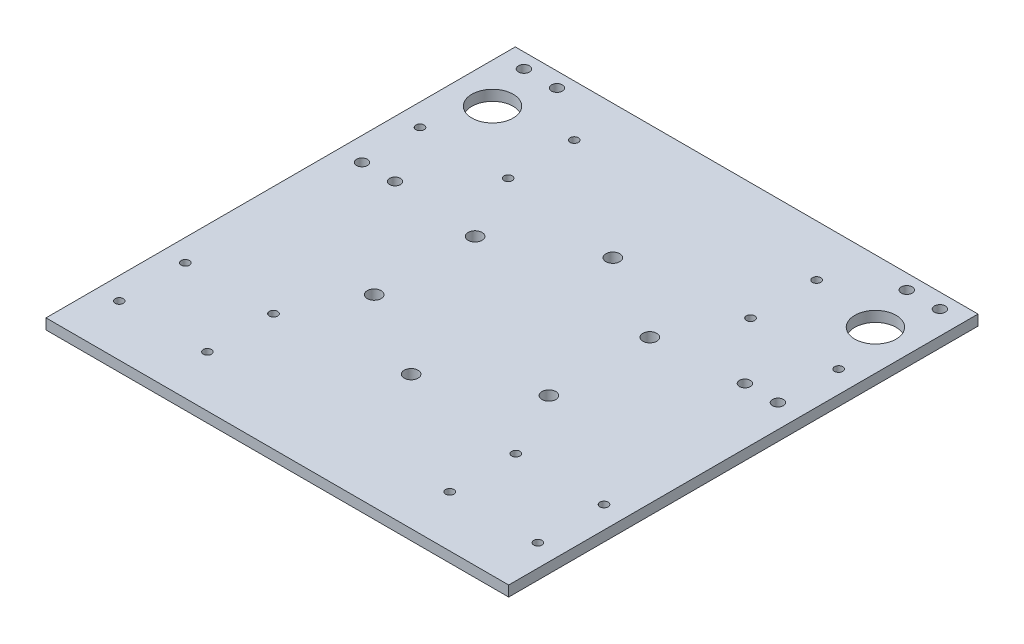
ISO-10303-21;
HEADER;
FILE_DESCRIPTION(('STEP AP214'),'2;1');
FILE_NAME('part.step','',(''),(''),'','','');
FILE_SCHEMA(('AUTOMOTIVE_DESIGN { 1 0 10303 214 1 1 1 1 }'));
ENDSEC;
DATA;
#1=APPLICATION_CONTEXT('core data for automotive mechanical design processes');
#2=APPLICATION_PROTOCOL_DEFINITION('international standard','automotive_design',2000,#1);
#3=PRODUCT_CONTEXT('',#1,'mechanical');
#4=PRODUCT('Part','Part','',(#3));
#5=PRODUCT_RELATED_PRODUCT_CATEGORY('part','',(#4));
#6=PRODUCT_DEFINITION_FORMATION('','',#4);
#7=PRODUCT_DEFINITION_CONTEXT('part definition',#1,'design');
#8=PRODUCT_DEFINITION('design','',#6,#7);
#9=PRODUCT_DEFINITION_SHAPE('','',#8);
#10=(LENGTH_UNIT() NAMED_UNIT(*) SI_UNIT(.MILLI.,.METRE.));
#11=(NAMED_UNIT(*) PLANE_ANGLE_UNIT() SI_UNIT($,.RADIAN.));
#12=(NAMED_UNIT(*) SI_UNIT($,.STERADIAN.) SOLID_ANGLE_UNIT());
#13=UNCERTAINTY_MEASURE_WITH_UNIT(LENGTH_MEASURE(1.E-05),#10,'distance_accuracy_value','');
#14=(GEOMETRIC_REPRESENTATION_CONTEXT(3) GLOBAL_UNCERTAINTY_ASSIGNED_CONTEXT((#13)) GLOBAL_UNIT_ASSIGNED_CONTEXT((#10,
#11,#12)) REPRESENTATION_CONTEXT('',''));
#15=CARTESIAN_POINT('',(0.,0.,0.));
#16=DIRECTION('',(0.,0.,1.));
#17=DIRECTION('',(1.,0.,0.));
#18=AXIS2_PLACEMENT_3D('',#15,#16,#17);
#19=CARTESIAN_POINT('',(0.,3.175,0.));
#20=DIRECTION('',(0.,-1.,0.));
#21=DIRECTION('',(0.,0.,-1.));
#22=AXIS2_PLACEMENT_3D('',#19,#20,#21);
#23=PLANE('',#22);
#24=CARTESIAN_POINT('',(-4.73926453636864E-12,3.175,30.525));
#25=DIRECTION('',(0.,1.,0.));
#26=DIRECTION('',(0.,0.,1.));
#27=AXIS2_PLACEMENT_3D('',#24,#25,#26);
#28=CIRCLE('',#27,2.1);
#29=CARTESIAN_POINT('',(-4.73926453636864E-12,3.175,32.625));
#30=VERTEX_POINT('',#29);
#31=EDGE_CURVE('E567',#30,#30,#28,.T.);
#32=ORIENTED_EDGE('',*,*,#31,.F.);
#33=EDGE_LOOP('',(#32));
#34=FACE_BOUND('',#33,.T.);
#35=CARTESIAN_POINT('',(26.4354254505184,3.175,15.2625000000027));
#36=DIRECTION('',(0.,1.,0.));
#37=DIRECTION('',(0.,0.,1.));
#38=AXIS2_PLACEMENT_3D('',#35,#36,#37);
#39=CIRCLE('',#38,2.1);
#40=CARTESIAN_POINT('',(26.4354254505184,3.175,17.3625000000027));
#41=VERTEX_POINT('',#40);
#42=EDGE_CURVE('E580',#41,#41,#39,.T.);
#43=ORIENTED_EDGE('',*,*,#42,.F.);
#44=EDGE_LOOP('',(#43));
#45=FACE_BOUND('',#44,.T.);
#46=CARTESIAN_POINT('',(-26.4354254505232,3.175,15.2624999999945));
#47=DIRECTION('',(0.,1.,0.));
#48=DIRECTION('',(0.,0.,1.));
#49=AXIS2_PLACEMENT_3D('',#46,#47,#48);
#50=CIRCLE('',#49,2.1);
#51=CARTESIAN_POINT('',(-26.4354254505232,3.175,17.3624999999945));
#52=VERTEX_POINT('',#51);
#53=EDGE_CURVE('E588',#52,#52,#50,.T.);
#54=ORIENTED_EDGE('',*,*,#53,.F.);
#55=EDGE_LOOP('',(#54));
#56=FACE_BOUND('',#55,.T.);
#57=CARTESIAN_POINT('',(26.4354254505208,3.175,-15.2624999999986));
#58=DIRECTION('',(0.,1.,0.));
#59=DIRECTION('',(0.,0.,1.));
#60=AXIS2_PLACEMENT_3D('',#57,#58,#59);
#61=CIRCLE('',#60,2.1);
#62=CARTESIAN_POINT('',(26.4354254505208,3.175,-13.1624999999986));
#63=VERTEX_POINT('',#62);
#64=EDGE_CURVE('E597',#63,#63,#61,.T.);
#65=ORIENTED_EDGE('',*,*,#64,.F.);
#66=EDGE_LOOP('',(#65));
#67=FACE_BOUND('',#66,.T.);
#68=CARTESIAN_POINT('',(0.,3.175,-30.525));
#69=DIRECTION('',(0.,1.,0.));
#70=DIRECTION('',(0.,0.,1.));
#71=AXIS2_PLACEMENT_3D('',#68,#69,#70);
#72=CIRCLE('',#71,2.1);
#73=CARTESIAN_POINT('',(0.,3.175,-28.425));
#74=VERTEX_POINT('',#73);
#75=EDGE_CURVE('E566',#74,#74,#72,.T.);
#76=ORIENTED_EDGE('',*,*,#75,.F.);
#77=EDGE_LOOP('',(#76));
#78=FACE_BOUND('',#77,.T.);
#79=CARTESIAN_POINT('',(-26.435425450516,3.175,-15.2625000000069));
#80=DIRECTION('',(0.,1.,0.));
#81=DIRECTION('',(0.,0.,1.));
#82=AXIS2_PLACEMENT_3D('',#79,#80,#81);
#83=CIRCLE('',#82,2.1);
#84=CARTESIAN_POINT('',(-26.435425450516,3.175,-13.1625000000069));
#85=VERTEX_POINT('',#84);
#86=EDGE_CURVE('E559',#85,#85,#83,.T.);
#87=ORIENTED_EDGE('',*,*,#86,.F.);
#88=EDGE_LOOP('',(#87));
#89=FACE_BOUND('',#88,.T.);
#90=CARTESIAN_POINT('',(62.9286,3.175,-17.5357));
#91=DIRECTION('',(0.,1.,0.));
#92=DIRECTION('',(0.,0.,1.));
#93=AXIS2_PLACEMENT_3D('',#90,#91,#92);
#94=CIRCLE('',#93,1.65);
#95=CARTESIAN_POINT('',(62.9286,3.175,-15.8857));
#96=VERTEX_POINT('',#95);
#97=EDGE_CURVE('E163',#96,#96,#94,.T.);
#98=ORIENTED_EDGE('',*,*,#97,.F.);
#99=EDGE_LOOP('',(#98));
#100=FACE_BOUND('',#99,.T.);
#101=CARTESIAN_POINT('',(36.6666666666667,3.175,-35.5));
#102=DIRECTION('',(0.,1.,0.));
#103=DIRECTION('',(0.,0.,1.));
#104=AXIS2_PLACEMENT_3D('',#101,#102,#103);
#105=CIRCLE('',#104,1.25);
#106=CARTESIAN_POINT('',(36.6666666666667,3.175,-34.25));
#107=VERTEX_POINT('',#106);
#108=EDGE_CURVE('E180',#107,#107,#105,.T.);
#109=ORIENTED_EDGE('',*,*,#108,.F.);
#110=EDGE_LOOP('',(#109));
#111=FACE_BOUND('',#110,.T.);
#112=CARTESIAN_POINT('',(-57.9286,3.175,-52.0357));
#113=DIRECTION('',(0.,1.,0.));
#114=DIRECTION('',(0.,0.,1.));
#115=AXIS2_PLACEMENT_3D('',#112,#113,#114);
#116=CIRCLE('',#115,6.25);
#117=CARTESIAN_POINT('',(-57.9286,3.175,-45.7857));
#118=VERTEX_POINT('',#117);
#119=EDGE_CURVE('E282',#118,#118,#116,.T.);
#120=ORIENTED_EDGE('',*,*,#119,.F.);
#121=EDGE_LOOP('',(#120));
#122=FACE_BOUND('',#121,.T.);
#123=CARTESIAN_POINT('',(-36.6666666666667,3.175,-55.5));
#124=DIRECTION('',(0.,1.,0.));
#125=DIRECTION('',(0.,0.,1.));
#126=AXIS2_PLACEMENT_3D('',#123,#124,#125);
#127=CIRCLE('',#126,1.25);
#128=CARTESIAN_POINT('',(-36.6666666666667,3.175,-54.25));
#129=VERTEX_POINT('',#128);
#130=EDGE_CURVE('E281',#129,#129,#127,.T.);
#131=ORIENTED_EDGE('',*,*,#130,.F.);
#132=EDGE_LOOP('',(#131));
#133=FACE_BOUND('',#132,.T.);
#134=CARTESIAN_POINT('',(52.9286,3.175,-66.5357));
#135=DIRECTION('',(0.,1.,0.));
#136=DIRECTION('',(0.,0.,1.));
#137=AXIS2_PLACEMENT_3D('',#134,#135,#136);
#138=CIRCLE('',#137,1.64999999999998);
#139=CARTESIAN_POINT('',(52.9286,3.175,-64.8857));
#140=VERTEX_POINT('',#139);
#141=EDGE_CURVE('E259',#140,#140,#138,.T.);
#142=ORIENTED_EDGE('',*,*,#141,.F.);
#143=EDGE_LOOP('',(#142));
#144=FACE_BOUND('',#143,.T.);
#145=CARTESIAN_POINT('',(-52.9286,3.175,-17.5357));
#146=DIRECTION('',(0.,1.,0.));
#147=DIRECTION('',(0.,0.,1.));
#148=AXIS2_PLACEMENT_3D('',#145,#146,#147);
#149=CIRCLE('',#148,1.64999999999998);
#150=CARTESIAN_POINT('',(-52.9286,3.175,-15.8857));
#151=VERTEX_POINT('',#150);
#152=EDGE_CURVE('E301',#151,#151,#149,.T.);
#153=ORIENTED_EDGE('',*,*,#152,.F.);
#154=EDGE_LOOP('',(#153));
#155=FACE_BOUND('',#154,.T.);
#156=CARTESIAN_POINT('',(-63.3333333333334,3.175,-35.5));
#157=DIRECTION('',(0.,1.,0.));
#158=DIRECTION('',(0.,0.,1.));
#159=AXIS2_PLACEMENT_3D('',#156,#157,#158);
#160=CIRCLE('',#159,1.25);
#161=CARTESIAN_POINT('',(-63.3333333333334,3.175,-34.25));
#162=VERTEX_POINT('',#161);
#163=EDGE_CURVE('E300',#162,#162,#160,.T.);
#164=ORIENTED_EDGE('',*,*,#163,.F.);
#165=EDGE_LOOP('',(#164));
#166=FACE_BOUND('',#165,.T.);
#167=CARTESIAN_POINT('',(63.3333333333334,3.175,35.5));
#168=DIRECTION('',(0.,1.,0.));
#169=DIRECTION('',(0.,0.,1.));
#170=AXIS2_PLACEMENT_3D('',#167,#168,#169);
#171=CIRCLE('',#170,1.25);
#172=CARTESIAN_POINT('',(63.3333333333334,3.175,36.75));
#173=VERTEX_POINT('',#172);
#174=EDGE_CURVE('E308',#173,#173,#171,.T.);
#175=ORIENTED_EDGE('',*,*,#174,.F.);
#176=EDGE_LOOP('',(#175));
#177=FACE_BOUND('',#176,.T.);
#178=CARTESIAN_POINT('',(36.6666666666667,3.175,55.5));
#179=DIRECTION('',(0.,1.,0.));
#180=DIRECTION('',(0.,0.,1.));
#181=AXIS2_PLACEMENT_3D('',#178,#179,#180);
#182=CIRCLE('',#181,1.25);
#183=CARTESIAN_POINT('',(36.6666666666667,3.175,56.75));
#184=VERTEX_POINT('',#183);
#185=EDGE_CURVE('E318',#184,#184,#182,.T.);
#186=ORIENTED_EDGE('',*,*,#185,.F.);
#187=EDGE_LOOP('',(#186));
#188=FACE_BOUND('',#187,.T.);
#189=CARTESIAN_POINT('',(-36.6666666666667,3.175,35.5));
#190=DIRECTION('',(0.,1.,0.));
#191=DIRECTION('',(0.,0.,1.));
#192=AXIS2_PLACEMENT_3D('',#189,#190,#191);
#193=CIRCLE('',#192,1.25);
#194=CARTESIAN_POINT('',(-36.6666666666667,3.175,36.75));
#195=VERTEX_POINT('',#194);
#196=EDGE_CURVE('E139',#195,#195,#193,.T.);
#197=ORIENTED_EDGE('',*,*,#196,.F.);
#198=EDGE_LOOP('',(#197));
#199=FACE_BOUND('',#198,.T.);
#200=CARTESIAN_POINT('',(-63.3333333333334,3.175,55.5));
#201=DIRECTION('',(0.,1.,0.));
#202=DIRECTION('',(0.,0.,1.));
#203=AXIS2_PLACEMENT_3D('',#200,#201,#202);
#204=CIRCLE('',#203,1.25);
#205=CARTESIAN_POINT('',(-63.3333333333334,3.175,56.75));
#206=VERTEX_POINT('',#205);
#207=EDGE_CURVE('E140',#206,#206,#204,.T.);
#208=ORIENTED_EDGE('',*,*,#207,.F.);
#209=EDGE_LOOP('',(#208));
#210=FACE_BOUND('',#209,.T.);
#211=CARTESIAN_POINT('',(-62.9286,3.175,-66.5357));
#212=DIRECTION('',(0.,1.,0.));
#213=DIRECTION('',(0.,0.,1.));
#214=AXIS2_PLACEMENT_3D('',#211,#212,#213);
#215=CIRCLE('',#214,1.65);
#216=CARTESIAN_POINT('',(-62.9286,3.175,-64.8857));
#217=VERTEX_POINT('',#216);
#218=EDGE_CURVE('E275',#217,#217,#215,.T.);
#219=ORIENTED_EDGE('',*,*,#218,.F.);
#220=EDGE_LOOP('',(#219));
#221=FACE_BOUND('',#220,.T.);
#222=DIRECTION('',(0.,0.,-1.));
#223=VECTOR('',#222,1.);
#224=CARTESIAN_POINT('',(70.,3.175,71.));
#225=LINE('',#224,#223);
#226=CARTESIAN_POINT('',(70.,3.175,71.));
#227=VERTEX_POINT('',#226);
#228=CARTESIAN_POINT('',(70.,3.175,-71.));
#229=VERTEX_POINT('',#228);
#230=EDGE_CURVE('E99',#227,#229,#225,.T.);
#231=ORIENTED_EDGE('',*,*,#230,.T.);
#232=DIRECTION('',(-1.,0.,0.));
#233=VECTOR('',#232,1.);
#234=CARTESIAN_POINT('',(-70.,3.175,-71.));
#235=LINE('',#234,#233);
#236=CARTESIAN_POINT('',(-70.,3.175,-71.));
#237=VERTEX_POINT('',#236);
#238=EDGE_CURVE('E94',#229,#237,#235,.T.);
#239=ORIENTED_EDGE('',*,*,#238,.T.);
#240=DIRECTION('',(0.,0.,1.));
#241=VECTOR('',#240,1.);
#242=CARTESIAN_POINT('',(-70.,3.175,71.));
#243=LINE('',#242,#241);
#244=CARTESIAN_POINT('',(-70.,3.175,71.));
#245=VERTEX_POINT('',#244);
#246=EDGE_CURVE('E97',#237,#245,#243,.T.);
#247=ORIENTED_EDGE('',*,*,#246,.T.);
#248=DIRECTION('',(1.,0.,0.));
#249=VECTOR('',#248,1.);
#250=CARTESIAN_POINT('',(-70.,3.175,71.));
#251=LINE('',#250,#249);
#252=EDGE_CURVE('E64',#245,#227,#251,.T.);
#253=ORIENTED_EDGE('',*,*,#252,.T.);
#254=EDGE_LOOP('',(#231,#239,#247,#253));
#255=FACE_BOUND('',#254,.T.);
#256=CARTESIAN_POINT('',(36.6666666666667,3.175,35.5));
#257=DIRECTION('',(0.,-1.,0.));
#258=DIRECTION('',(0.,0.,-1.));
#259=AXIS2_PLACEMENT_3D('',#256,#257,#258);
#260=CIRCLE('',#259,1.25);
#261=CARTESIAN_POINT('',(36.6666666666667,3.175,34.25));
#262=VERTEX_POINT('',#261);
#263=EDGE_CURVE('E127',#262,#262,#260,.T.);
#264=ORIENTED_EDGE('',*,*,#263,.T.);
#265=EDGE_LOOP('',(#264));
#266=FACE_BOUND('',#265,.T.);
#267=CARTESIAN_POINT('',(-36.6666666666667,3.175,55.5));
#268=DIRECTION('',(0.,-1.,0.));
#269=DIRECTION('',(0.,0.,-1.));
#270=AXIS2_PLACEMENT_3D('',#267,#268,#269);
#271=CIRCLE('',#270,1.25);
#272=CARTESIAN_POINT('',(-36.6666666666667,3.175,54.25));
#273=VERTEX_POINT('',#272);
#274=EDGE_CURVE('E326',#273,#273,#271,.T.);
#275=ORIENTED_EDGE('',*,*,#274,.T.);
#276=EDGE_LOOP('',(#275));
#277=FACE_BOUND('',#276,.T.);
#278=CARTESIAN_POINT('',(63.3333333333334,3.175,55.5));
#279=DIRECTION('',(0.,-1.,0.));
#280=DIRECTION('',(0.,0.,-1.));
#281=AXIS2_PLACEMENT_3D('',#278,#279,#280);
#282=CIRCLE('',#281,1.25);
#283=CARTESIAN_POINT('',(63.3333333333334,3.175,54.25));
#284=VERTEX_POINT('',#283);
#285=EDGE_CURVE('E319',#284,#284,#282,.T.);
#286=ORIENTED_EDGE('',*,*,#285,.T.);
#287=EDGE_LOOP('',(#286));
#288=FACE_BOUND('',#287,.T.);
#289=CARTESIAN_POINT('',(-62.9286,3.175,-17.5357));
#290=DIRECTION('',(0.,-1.,0.));
#291=DIRECTION('',(0.,0.,-1.));
#292=AXIS2_PLACEMENT_3D('',#289,#290,#291);
#293=CIRCLE('',#292,1.65);
#294=CARTESIAN_POINT('',(-62.9286,3.175,-19.1857));
#295=VERTEX_POINT('',#294);
#296=EDGE_CURVE('E258',#295,#295,#293,.T.);
#297=ORIENTED_EDGE('',*,*,#296,.T.);
#298=EDGE_LOOP('',(#297));
#299=FACE_BOUND('',#298,.T.);
#300=CARTESIAN_POINT('',(-52.9286,3.175,-66.5357));
#301=DIRECTION('',(0.,-1.,0.));
#302=DIRECTION('',(0.,0.,-1.));
#303=AXIS2_PLACEMENT_3D('',#300,#301,#302);
#304=CIRCLE('',#303,1.64999999999998);
#305=CARTESIAN_POINT('',(-52.9286,3.175,-68.1857));
#306=VERTEX_POINT('',#305);
#307=EDGE_CURVE('E269',#306,#306,#304,.T.);
#308=ORIENTED_EDGE('',*,*,#307,.T.);
#309=EDGE_LOOP('',(#308));
#310=FACE_BOUND('',#309,.T.);
#311=CARTESIAN_POINT('',(-36.6666666666667,3.175,-35.5));
#312=DIRECTION('',(0.,-1.,0.));
#313=DIRECTION('',(0.,0.,-1.));
#314=AXIS2_PLACEMENT_3D('',#311,#312,#313);
#315=CIRCLE('',#314,1.25);
#316=CARTESIAN_POINT('',(-36.6666666666667,3.175,-36.75));
#317=VERTEX_POINT('',#316);
#318=EDGE_CURVE('E517',#317,#317,#315,.T.);
#319=ORIENTED_EDGE('',*,*,#318,.T.);
#320=EDGE_LOOP('',(#319));
#321=FACE_BOUND('',#320,.T.);
#322=CARTESIAN_POINT('',(52.9286,3.175,-17.5357));
#323=DIRECTION('',(0.,-1.,0.));
#324=DIRECTION('',(0.,0.,-1.));
#325=AXIS2_PLACEMENT_3D('',#322,#323,#324);
#326=CIRCLE('',#325,1.64999999999998);
#327=CARTESIAN_POINT('',(52.9286,3.175,-19.1857));
#328=VERTEX_POINT('',#327);
#329=EDGE_CURVE('E191',#328,#328,#326,.T.);
#330=ORIENTED_EDGE('',*,*,#329,.T.);
#331=EDGE_LOOP('',(#330));
#332=FACE_BOUND('',#331,.T.);
#333=CARTESIAN_POINT('',(-63.3333333333334,3.175,35.5));
#334=DIRECTION('',(0.,-1.,0.));
#335=DIRECTION('',(0.,0.,-1.));
#336=AXIS2_PLACEMENT_3D('',#333,#334,#335);
#337=CIRCLE('',#336,1.25);
#338=CARTESIAN_POINT('',(-63.3333333333334,3.175,34.25));
#339=VERTEX_POINT('',#338);
#340=EDGE_CURVE('E164',#339,#339,#337,.T.);
#341=ORIENTED_EDGE('',*,*,#340,.T.);
#342=EDGE_LOOP('',(#341));
#343=FACE_BOUND('',#342,.T.);
#344=CARTESIAN_POINT('',(62.9286,3.175,-66.5357));
#345=DIRECTION('',(0.,-1.,0.));
#346=DIRECTION('',(0.,0.,-1.));
#347=AXIS2_PLACEMENT_3D('',#344,#345,#346);
#348=CIRCLE('',#347,1.65);
#349=CARTESIAN_POINT('',(62.9286,3.175,-68.1857));
#350=VERTEX_POINT('',#349);
#351=EDGE_CURVE('E241',#350,#350,#348,.T.);
#352=ORIENTED_EDGE('',*,*,#351,.T.);
#353=EDGE_LOOP('',(#352));
#354=FACE_BOUND('',#353,.T.);
#355=CARTESIAN_POINT('',(36.6666666666667,3.175,-55.5));
#356=DIRECTION('',(0.,-1.,0.));
#357=DIRECTION('',(0.,0.,-1.));
#358=AXIS2_PLACEMENT_3D('',#355,#356,#357);
#359=CIRCLE('',#358,1.25);
#360=CARTESIAN_POINT('',(36.6666666666667,3.175,-56.75));
#361=VERTEX_POINT('',#360);
#362=EDGE_CURVE('E242',#361,#361,#359,.T.);
#363=ORIENTED_EDGE('',*,*,#362,.T.);
#364=EDGE_LOOP('',(#363));
#365=FACE_BOUND('',#364,.T.);
#366=CARTESIAN_POINT('',(57.9286,3.175,-52.0357));
#367=DIRECTION('',(0.,-1.,0.));
#368=DIRECTION('',(0.,0.,-1.));
#369=AXIS2_PLACEMENT_3D('',#366,#367,#368);
#370=CIRCLE('',#369,6.24999999999999);
#371=CARTESIAN_POINT('',(57.9286,3.175,-58.2857));
#372=VERTEX_POINT('',#371);
#373=EDGE_CURVE('E234',#372,#372,#370,.T.);
#374=ORIENTED_EDGE('',*,*,#373,.T.);
#375=EDGE_LOOP('',(#374));
#376=FACE_BOUND('',#375,.T.);
#377=CARTESIAN_POINT('',(63.3333333333334,3.175,-35.5));
#378=DIRECTION('',(0.,-1.,0.));
#379=DIRECTION('',(0.,0.,-1.));
#380=AXIS2_PLACEMENT_3D('',#377,#378,#379);
#381=CIRCLE('',#380,1.25);
#382=CARTESIAN_POINT('',(63.3333333333334,3.175,-36.75));
#383=VERTEX_POINT('',#382);
#384=EDGE_CURVE('E230',#383,#383,#381,.T.);
#385=ORIENTED_EDGE('',*,*,#384,.T.);
#386=EDGE_LOOP('',(#385));
#387=FACE_BOUND('',#386,.T.);
#388=ADVANCED_FACE('F46',(#34,#45,#56,#67,#78,#89,#100,#111,#122,#133,#144,#155,#166,#177,#188,
#199,#210,#221,#255,#266,#277,#288,#299,#310,#321,#332,#343,#354,#365,#376,#387),#23,.F.);
#389=CARTESIAN_POINT('',(0.,0.,0.));
#390=DIRECTION('',(0.,-1.,0.));
#391=DIRECTION('',(0.,0.,-1.));
#392=AXIS2_PLACEMENT_3D('',#389,#390,#391);
#393=PLANE('',#392);
#394=CARTESIAN_POINT('',(-4.73926453636864E-12,0.,30.525));
#395=DIRECTION('',(0.,-1.,0.));
#396=DIRECTION('',(0.,0.,-1.));
#397=AXIS2_PLACEMENT_3D('',#394,#395,#396);
#398=CIRCLE('',#397,2.1);
#399=CARTESIAN_POINT('',(-4.73926453636864E-12,0.,28.425));
#400=VERTEX_POINT('',#399);
#401=EDGE_CURVE('E573',#400,#400,#398,.F.);
#402=ORIENTED_EDGE('',*,*,#401,.T.);
#403=EDGE_LOOP('',(#402));
#404=FACE_BOUND('',#403,.T.);
#405=CARTESIAN_POINT('',(26.4354254505184,0.,15.2625000000027));
#406=DIRECTION('',(0.,-1.,0.));
#407=DIRECTION('',(0.,0.,-1.));
#408=AXIS2_PLACEMENT_3D('',#405,#406,#407);
#409=CIRCLE('',#408,2.1);
#410=CARTESIAN_POINT('',(26.4354254505184,0.,13.1625000000027));
#411=VERTEX_POINT('',#410);
#412=EDGE_CURVE('E572',#411,#411,#409,.F.);
#413=ORIENTED_EDGE('',*,*,#412,.T.);
#414=EDGE_LOOP('',(#413));
#415=FACE_BOUND('',#414,.T.);
#416=CARTESIAN_POINT('',(-26.4354254505232,0.,15.2624999999945));
#417=DIRECTION('',(0.,-1.,0.));
#418=DIRECTION('',(0.,0.,-1.));
#419=AXIS2_PLACEMENT_3D('',#416,#417,#418);
#420=CIRCLE('',#419,2.1);
#421=CARTESIAN_POINT('',(-26.4354254505232,0.,13.1624999999945));
#422=VERTEX_POINT('',#421);
#423=EDGE_CURVE('E585',#422,#422,#420,.F.);
#424=ORIENTED_EDGE('',*,*,#423,.T.);
#425=EDGE_LOOP('',(#424));
#426=FACE_BOUND('',#425,.T.);
#427=CARTESIAN_POINT('',(26.4354254505208,0.,-15.2624999999986));
#428=DIRECTION('',(0.,-1.,0.));
#429=DIRECTION('',(0.,0.,-1.));
#430=AXIS2_PLACEMENT_3D('',#427,#428,#429);
#431=CIRCLE('',#430,2.1);
#432=CARTESIAN_POINT('',(26.4354254505208,0.,-17.3624999999986));
#433=VERTEX_POINT('',#432);
#434=EDGE_CURVE('E593',#433,#433,#431,.F.);
#435=ORIENTED_EDGE('',*,*,#434,.T.);
#436=EDGE_LOOP('',(#435));
#437=FACE_BOUND('',#436,.T.);
#438=CARTESIAN_POINT('',(0.,0.,-30.525));
#439=DIRECTION('',(0.,-1.,0.));
#440=DIRECTION('',(0.,0.,-1.));
#441=AXIS2_PLACEMENT_3D('',#438,#439,#440);
#442=CIRCLE('',#441,2.1);
#443=CARTESIAN_POINT('',(0.,0.,-32.625));
#444=VERTEX_POINT('',#443);
#445=EDGE_CURVE('E602',#444,#444,#442,.F.);
#446=ORIENTED_EDGE('',*,*,#445,.T.);
#447=EDGE_LOOP('',(#446));
#448=FACE_BOUND('',#447,.T.);
#449=CARTESIAN_POINT('',(-26.435425450516,0.,-15.2625000000069));
#450=DIRECTION('',(0.,-1.,0.));
#451=DIRECTION('',(0.,0.,-1.));
#452=AXIS2_PLACEMENT_3D('',#449,#450,#451);
#453=CIRCLE('',#452,2.1);
#454=CARTESIAN_POINT('',(-26.435425450516,0.,-17.3625000000069));
#455=VERTEX_POINT('',#454);
#456=EDGE_CURVE('E553',#455,#455,#453,.F.);
#457=ORIENTED_EDGE('',*,*,#456,.T.);
#458=EDGE_LOOP('',(#457));
#459=FACE_BOUND('',#458,.T.);
#460=CARTESIAN_POINT('',(57.9286,0.,-52.0357));
#461=DIRECTION('',(0.,-1.,0.));
#462=DIRECTION('',(0.,0.,-1.));
#463=AXIS2_PLACEMENT_3D('',#460,#461,#462);
#464=CIRCLE('',#463,6.24999999999999);
#465=CARTESIAN_POINT('',(57.9286,0.,-58.2857));
#466=VERTEX_POINT('',#465);
#467=EDGE_CURVE('E196',#466,#466,#464,.T.);
#468=ORIENTED_EDGE('',*,*,#467,.F.);
#469=EDGE_LOOP('',(#468));
#470=FACE_BOUND('',#469,.T.);
#471=CARTESIAN_POINT('',(62.9286,0.,-66.5357));
#472=DIRECTION('',(0.,-1.,0.));
#473=DIRECTION('',(0.,0.,-1.));
#474=AXIS2_PLACEMENT_3D('',#471,#472,#473);
#475=CIRCLE('',#474,1.65);
#476=CARTESIAN_POINT('',(62.9286,0.,-68.1857));
#477=VERTEX_POINT('',#476);
#478=EDGE_CURVE('E238',#477,#477,#475,.T.);
#479=ORIENTED_EDGE('',*,*,#478,.F.);
#480=EDGE_LOOP('',(#479));
#481=FACE_BOUND('',#480,.T.);
#482=CARTESIAN_POINT('',(52.9286,0.,-17.5357));
#483=DIRECTION('',(0.,-1.,0.));
#484=DIRECTION('',(0.,0.,-1.));
#485=AXIS2_PLACEMENT_3D('',#482,#483,#484);
#486=CIRCLE('',#485,1.64999999999998);
#487=CARTESIAN_POINT('',(52.9286,0.,-19.1857));
#488=VERTEX_POINT('',#487);
#489=EDGE_CURVE('E169',#488,#488,#486,.T.);
#490=ORIENTED_EDGE('',*,*,#489,.F.);
#491=EDGE_LOOP('',(#490));
#492=FACE_BOUND('',#491,.T.);
#493=CARTESIAN_POINT('',(36.6666666666667,0.,-35.5));
#494=DIRECTION('',(0.,-1.,0.));
#495=DIRECTION('',(0.,0.,-1.));
#496=AXIS2_PLACEMENT_3D('',#493,#494,#495);
#497=CIRCLE('',#496,1.25);
#498=CARTESIAN_POINT('',(36.6666666666667,0.,-36.75));
#499=VERTEX_POINT('',#498);
#500=EDGE_CURVE('E187',#499,#499,#497,.F.);
#501=ORIENTED_EDGE('',*,*,#500,.T.);
#502=EDGE_LOOP('',(#501));
#503=FACE_BOUND('',#502,.T.);
#504=CARTESIAN_POINT('',(-52.9286,0.,-66.5357));
#505=DIRECTION('',(0.,-1.,0.));
#506=DIRECTION('',(0.,0.,-1.));
#507=AXIS2_PLACEMENT_3D('',#504,#505,#506);
#508=CIRCLE('',#507,1.64999999999998);
#509=CARTESIAN_POINT('',(-52.9286,0.,-68.1857));
#510=VERTEX_POINT('',#509);
#511=EDGE_CURVE('E276',#510,#510,#508,.T.);
#512=ORIENTED_EDGE('',*,*,#511,.F.);
#513=EDGE_LOOP('',(#512));
#514=FACE_BOUND('',#513,.T.);
#515=CARTESIAN_POINT('',(52.9286,0.,-66.5357));
#516=DIRECTION('',(0.,-1.,0.));
#517=DIRECTION('',(0.,0.,-1.));
#518=AXIS2_PLACEMENT_3D('',#515,#516,#517);
#519=CIRCLE('',#518,1.64999999999998);
#520=CARTESIAN_POINT('',(52.9286,0.,-68.1857));
#521=VERTEX_POINT('',#520);
#522=EDGE_CURVE('E247',#521,#521,#519,.F.);
#523=ORIENTED_EDGE('',*,*,#522,.T.);
#524=EDGE_LOOP('',(#523));
#525=FACE_BOUND('',#524,.T.);
#526=CARTESIAN_POINT('',(63.3333333333334,0.,55.5));
#527=DIRECTION('',(0.,-1.,0.));
#528=DIRECTION('',(0.,0.,-1.));
#529=AXIS2_PLACEMENT_3D('',#526,#527,#528);
#530=CIRCLE('',#529,1.25);
#531=CARTESIAN_POINT('',(63.3333333333334,0.,54.25));
#532=VERTEX_POINT('',#531);
#533=EDGE_CURVE('E548',#532,#532,#530,.T.);
#534=ORIENTED_EDGE('',*,*,#533,.F.);
#535=EDGE_LOOP('',(#534));
#536=FACE_BOUND('',#535,.T.);
#537=CARTESIAN_POINT('',(-36.6666666666667,0.,35.5));
#538=DIRECTION('',(0.,-1.,0.));
#539=DIRECTION('',(0.,0.,-1.));
#540=AXIS2_PLACEMENT_3D('',#537,#538,#539);
#541=CIRCLE('',#540,1.25);
#542=CARTESIAN_POINT('',(-36.6666666666667,0.,34.25));
#543=VERTEX_POINT('',#542);
#544=EDGE_CURVE('E135',#543,#543,#541,.F.);
#545=ORIENTED_EDGE('',*,*,#544,.T.);
#546=EDGE_LOOP('',(#545));
#547=FACE_BOUND('',#546,.T.);
#548=CARTESIAN_POINT('',(-63.3333333333334,0.,55.5));
#549=DIRECTION('',(0.,-1.,0.));
#550=DIRECTION('',(0.,0.,-1.));
#551=AXIS2_PLACEMENT_3D('',#548,#549,#550);
#552=CIRCLE('',#551,1.25);
#553=CARTESIAN_POINT('',(-63.3333333333334,0.,54.25));
#554=VERTEX_POINT('',#553);
#555=EDGE_CURVE('E146',#554,#554,#552,.F.);
#556=ORIENTED_EDGE('',*,*,#555,.T.);
#557=EDGE_LOOP('',(#556));
#558=FACE_BOUND('',#557,.T.);
#559=CARTESIAN_POINT('',(36.6666666666667,0.,35.5));
#560=DIRECTION('',(0.,-1.,0.));
#561=DIRECTION('',(0.,0.,-1.));
#562=AXIS2_PLACEMENT_3D('',#559,#560,#561);
#563=CIRCLE('',#562,1.25);
#564=CARTESIAN_POINT('',(36.6666666666667,0.,34.25));
#565=VERTEX_POINT('',#564);
#566=EDGE_CURVE('E134',#565,#565,#563,.T.);
#567=ORIENTED_EDGE('',*,*,#566,.F.);
#568=EDGE_LOOP('',(#567));
#569=FACE_BOUND('',#568,.T.);
#570=CARTESIAN_POINT('',(-62.9286,0.,-66.5357));
#571=DIRECTION('',(0.,-1.,0.));
#572=DIRECTION('',(0.,0.,-1.));
#573=AXIS2_PLACEMENT_3D('',#570,#571,#572);
#574=CIRCLE('',#573,1.65);
#575=CARTESIAN_POINT('',(-62.9286,0.,-68.1857));
#576=VERTEX_POINT('',#575);
#577=EDGE_CURVE('E382',#576,#576,#574,.F.);
#578=ORIENTED_EDGE('',*,*,#577,.T.);
#579=EDGE_LOOP('',(#578));
#580=FACE_BOUND('',#579,.T.);
#581=DIRECTION('',(0.,0.,-1.));
#582=VECTOR('',#581,1.);
#583=CARTESIAN_POINT('',(70.,0.,71.));
#584=LINE('',#583,#582);
#585=CARTESIAN_POINT('',(70.,0.,71.));
#586=VERTEX_POINT('',#585);
#587=CARTESIAN_POINT('',(70.,0.,-71.));
#588=VERTEX_POINT('',#587);
#589=EDGE_CURVE('E379',#586,#588,#584,.T.);
#590=ORIENTED_EDGE('',*,*,#589,.F.);
#591=DIRECTION('',(1.,0.,0.));
#592=VECTOR('',#591,1.);
#593=CARTESIAN_POINT('',(-70.,0.,71.));
#594=LINE('',#593,#592);
#595=CARTESIAN_POINT('',(-70.,0.,71.));
#596=VERTEX_POINT('',#595);
#597=EDGE_CURVE('E87',#596,#586,#594,.T.);
#598=ORIENTED_EDGE('',*,*,#597,.F.);
#599=DIRECTION('',(0.,0.,1.));
#600=VECTOR('',#599,1.);
#601=CARTESIAN_POINT('',(-70.,0.,71.));
#602=LINE('',#601,#600);
#603=CARTESIAN_POINT('',(-70.,0.,-71.));
#604=VERTEX_POINT('',#603);
#605=EDGE_CURVE('E81',#604,#596,#602,.T.);
#606=ORIENTED_EDGE('',*,*,#605,.F.);
#607=DIRECTION('',(-1.,0.,0.));
#608=VECTOR('',#607,1.);
#609=CARTESIAN_POINT('',(-70.,0.,-71.));
#610=LINE('',#609,#608);
#611=EDGE_CURVE('E104',#588,#604,#610,.T.);
#612=ORIENTED_EDGE('',*,*,#611,.F.);
#613=EDGE_LOOP('',(#590,#598,#606,#612));
#614=FACE_BOUND('',#613,.T.);
#615=CARTESIAN_POINT('',(-36.6666666666667,0.,55.5));
#616=DIRECTION('',(0.,-1.,0.));
#617=DIRECTION('',(0.,0.,-1.));
#618=AXIS2_PLACEMENT_3D('',#615,#616,#617);
#619=CIRCLE('',#618,1.25);
#620=CARTESIAN_POINT('',(-36.6666666666667,0.,54.25));
#621=VERTEX_POINT('',#620);
#622=EDGE_CURVE('E133',#621,#621,#619,.T.);
#623=ORIENTED_EDGE('',*,*,#622,.F.);
#624=EDGE_LOOP('',(#623));
#625=FACE_BOUND('',#624,.T.);
#626=CARTESIAN_POINT('',(36.6666666666667,0.,55.5));
#627=DIRECTION('',(0.,-1.,0.));
#628=DIRECTION('',(0.,0.,-1.));
#629=AXIS2_PLACEMENT_3D('',#626,#627,#628);
#630=CIRCLE('',#629,1.25);
#631=CARTESIAN_POINT('',(36.6666666666667,0.,54.25));
#632=VERTEX_POINT('',#631);
#633=EDGE_CURVE('E315',#632,#632,#630,.F.);
#634=ORIENTED_EDGE('',*,*,#633,.T.);
#635=EDGE_LOOP('',(#634));
#636=FACE_BOUND('',#635,.T.);
#637=CARTESIAN_POINT('',(63.3333333333334,0.,35.5));
#638=DIRECTION('',(0.,-1.,0.));
#639=DIRECTION('',(0.,0.,-1.));
#640=AXIS2_PLACEMENT_3D('',#637,#638,#639);
#641=CIRCLE('',#640,1.25);
#642=CARTESIAN_POINT('',(63.3333333333334,0.,34.25));
#643=VERTEX_POINT('',#642);
#644=EDGE_CURVE('E314',#643,#643,#641,.F.);
#645=ORIENTED_EDGE('',*,*,#644,.T.);
#646=EDGE_LOOP('',(#645));
#647=FACE_BOUND('',#646,.T.);
#648=CARTESIAN_POINT('',(-63.3333333333334,0.,-35.5));
#649=DIRECTION('',(0.,-1.,0.));
#650=DIRECTION('',(0.,0.,-1.));
#651=AXIS2_PLACEMENT_3D('',#648,#649,#650);
#652=CIRCLE('',#651,1.25);
#653=CARTESIAN_POINT('',(-63.3333333333334,0.,-36.75));
#654=VERTEX_POINT('',#653);
#655=EDGE_CURVE('E296',#654,#654,#652,.F.);
#656=ORIENTED_EDGE('',*,*,#655,.T.);
#657=EDGE_LOOP('',(#656));
#658=FACE_BOUND('',#657,.T.);
#659=CARTESIAN_POINT('',(-52.9286,0.,-17.5357));
#660=DIRECTION('',(0.,-1.,0.));
#661=DIRECTION('',(0.,0.,-1.));
#662=AXIS2_PLACEMENT_3D('',#659,#660,#661);
#663=CIRCLE('',#662,1.64999999999998);
#664=CARTESIAN_POINT('',(-52.9286,0.,-19.1857));
#665=VERTEX_POINT('',#664);
#666=EDGE_CURVE('E264',#665,#665,#663,.F.);
#667=ORIENTED_EDGE('',*,*,#666,.T.);
#668=EDGE_LOOP('',(#667));
#669=FACE_BOUND('',#668,.T.);
#670=CARTESIAN_POINT('',(-62.9286,0.,-17.5357));
#671=DIRECTION('',(0.,-1.,0.));
#672=DIRECTION('',(0.,0.,-1.));
#673=AXIS2_PLACEMENT_3D('',#670,#671,#672);
#674=CIRCLE('',#673,1.65);
#675=CARTESIAN_POINT('',(-62.9286,0.,-19.1857));
#676=VERTEX_POINT('',#675);
#677=EDGE_CURVE('E254',#676,#676,#674,.T.);
#678=ORIENTED_EDGE('',*,*,#677,.F.);
#679=EDGE_LOOP('',(#678));
#680=FACE_BOUND('',#679,.T.);
#681=CARTESIAN_POINT('',(-36.6666666666667,0.,-55.5));
#682=DIRECTION('',(0.,-1.,0.));
#683=DIRECTION('',(0.,0.,-1.));
#684=AXIS2_PLACEMENT_3D('',#681,#682,#683);
#685=CIRCLE('',#684,1.25);
#686=CARTESIAN_POINT('',(-36.6666666666667,0.,-56.75));
#687=VERTEX_POINT('',#686);
#688=EDGE_CURVE('E277',#687,#687,#685,.F.);
#689=ORIENTED_EDGE('',*,*,#688,.T.);
#690=EDGE_LOOP('',(#689));
#691=FACE_BOUND('',#690,.T.);
#692=CARTESIAN_POINT('',(-57.9286,0.,-52.0357));
#693=DIRECTION('',(0.,-1.,0.));
#694=DIRECTION('',(0.,0.,-1.));
#695=AXIS2_PLACEMENT_3D('',#692,#693,#694);
#696=CIRCLE('',#695,6.25);
#697=CARTESIAN_POINT('',(-57.9286,0.,-58.2857));
#698=VERTEX_POINT('',#697);
#699=EDGE_CURVE('E415',#698,#698,#696,.F.);
#700=ORIENTED_EDGE('',*,*,#699,.T.);
#701=EDGE_LOOP('',(#700));
#702=FACE_BOUND('',#701,.T.);
#703=CARTESIAN_POINT('',(-36.6666666666667,0.,-35.5));
#704=DIRECTION('',(0.,-1.,0.));
#705=DIRECTION('',(0.,0.,-1.));
#706=AXIS2_PLACEMENT_3D('',#703,#704,#705);
#707=CIRCLE('',#706,1.25);
#708=CARTESIAN_POINT('',(-36.6666666666667,0.,-36.75));
#709=VERTEX_POINT('',#708);
#710=EDGE_CURVE('E306',#709,#709,#707,.T.);
#711=ORIENTED_EDGE('',*,*,#710,.F.);
#712=EDGE_LOOP('',(#711));
#713=FACE_BOUND('',#712,.T.);
#714=CARTESIAN_POINT('',(62.9286,0.,-17.5357));
#715=DIRECTION('',(0.,-1.,0.));
#716=DIRECTION('',(0.,0.,-1.));
#717=AXIS2_PLACEMENT_3D('',#714,#715,#716);
#718=CIRCLE('',#717,1.65);
#719=CARTESIAN_POINT('',(62.9286,0.,-19.1857));
#720=VERTEX_POINT('',#719);
#721=EDGE_CURVE('E159',#720,#720,#718,.F.);
#722=ORIENTED_EDGE('',*,*,#721,.T.);
#723=EDGE_LOOP('',(#722));
#724=FACE_BOUND('',#723,.T.);
#725=CARTESIAN_POINT('',(-63.3333333333334,0.,35.5));
#726=DIRECTION('',(0.,-1.,0.));
#727=DIRECTION('',(0.,0.,-1.));
#728=AXIS2_PLACEMENT_3D('',#725,#726,#727);
#729=CIRCLE('',#728,1.25);
#730=CARTESIAN_POINT('',(-63.3333333333334,0.,34.25));
#731=VERTEX_POINT('',#730);
#732=EDGE_CURVE('E145',#731,#731,#729,.T.);
#733=ORIENTED_EDGE('',*,*,#732,.F.);
#734=EDGE_LOOP('',(#733));
#735=FACE_BOUND('',#734,.T.);
#736=CARTESIAN_POINT('',(36.6666666666667,0.,-55.5));
#737=DIRECTION('',(0.,-1.,0.));
#738=DIRECTION('',(0.,0.,-1.));
#739=AXIS2_PLACEMENT_3D('',#736,#737,#738);
#740=CIRCLE('',#739,1.25);
#741=CARTESIAN_POINT('',(36.6666666666667,0.,-56.75));
#742=VERTEX_POINT('',#741);
#743=EDGE_CURVE('E225',#742,#742,#740,.T.);
#744=ORIENTED_EDGE('',*,*,#743,.F.);
#745=EDGE_LOOP('',(#744));
#746=FACE_BOUND('',#745,.T.);
#747=CARTESIAN_POINT('',(63.3333333333334,0.,-35.5));
#748=DIRECTION('',(0.,-1.,0.));
#749=DIRECTION('',(0.,0.,-1.));
#750=AXIS2_PLACEMENT_3D('',#747,#748,#749);
#751=CIRCLE('',#750,1.25);
#752=CARTESIAN_POINT('',(63.3333333333334,0.,-36.75));
#753=VERTEX_POINT('',#752);
#754=EDGE_CURVE('E186',#753,#753,#751,.T.);
#755=ORIENTED_EDGE('',*,*,#754,.F.);
#756=EDGE_LOOP('',(#755));
#757=FACE_BOUND('',#756,.T.);
#758=ADVANCED_FACE('F217',(#404,#415,#426,#437,#448,#459,#470,#481,#492,#503,#514,#525,#536,
#547,#558,#569,#580,#614,#625,#636,#647,#658,#669,#680,#691,#702,#713,#724,#735,#746,#757),#393,.T.);
#759=CARTESIAN_POINT('',(70.,3.175,71.));
#760=DIRECTION('',(-1.,0.,0.));
#761=DIRECTION('',(0.,0.,1.));
#762=AXIS2_PLACEMENT_3D('',#759,#760,#761);
#763=PLANE('',#762);
#764=ORIENTED_EDGE('',*,*,#589,.T.);
#765=DIRECTION('',(0.,-1.,0.));
#766=VECTOR('',#765,1.);
#767=CARTESIAN_POINT('',(70.,3.175,-71.));
#768=LINE('',#767,#766);
#769=EDGE_CURVE('E12',#229,#588,#768,.T.);
#770=ORIENTED_EDGE('',*,*,#769,.F.);
#771=ORIENTED_EDGE('',*,*,#230,.F.);
#772=DIRECTION('',(0.,-1.,0.));
#773=VECTOR('',#772,1.);
#774=CARTESIAN_POINT('',(70.,3.175,71.));
#775=LINE('',#774,#773);
#776=EDGE_CURVE('E111',#227,#586,#775,.T.);
#777=ORIENTED_EDGE('',*,*,#776,.T.);
#778=EDGE_LOOP('',(#764,#770,#771,#777));
#779=FACE_BOUND('',#778,.T.);
#780=ADVANCED_FACE('F48',(#779),#763,.F.);
#781=CARTESIAN_POINT('',(-70.,3.175,-71.));
#782=DIRECTION('',(0.,0.,1.));
#783=DIRECTION('',(1.,0.,0.));
#784=AXIS2_PLACEMENT_3D('',#781,#782,#783);
#785=PLANE('',#784);
#786=ORIENTED_EDGE('',*,*,#611,.T.);
#787=DIRECTION('',(0.,-1.,0.));
#788=VECTOR('',#787,1.);
#789=CARTESIAN_POINT('',(-70.,3.175,-71.));
#790=LINE('',#789,#788);
#791=EDGE_CURVE('E56',#237,#604,#790,.T.);
#792=ORIENTED_EDGE('',*,*,#791,.F.);
#793=ORIENTED_EDGE('',*,*,#238,.F.);
#794=ORIENTED_EDGE('',*,*,#769,.T.);
#795=EDGE_LOOP('',(#786,#792,#793,#794));
#796=FACE_BOUND('',#795,.T.);
#797=ADVANCED_FACE('F103',(#796),#785,.F.);
#798=CARTESIAN_POINT('',(-70.,3.175,71.));
#799=DIRECTION('',(1.,0.,0.));
#800=DIRECTION('',(0.,0.,-1.));
#801=AXIS2_PLACEMENT_3D('',#798,#799,#800);
#802=PLANE('',#801);
#803=ORIENTED_EDGE('',*,*,#605,.T.);
#804=DIRECTION('',(0.,-1.,0.));
#805=VECTOR('',#804,1.);
#806=CARTESIAN_POINT('',(-70.,3.175,71.));
#807=LINE('',#806,#805);
#808=EDGE_CURVE('E106',#245,#596,#807,.T.);
#809=ORIENTED_EDGE('',*,*,#808,.F.);
#810=ORIENTED_EDGE('',*,*,#246,.F.);
#811=ORIENTED_EDGE('',*,*,#791,.T.);
#812=EDGE_LOOP('',(#803,#809,#810,#811));
#813=FACE_BOUND('',#812,.T.);
#814=ADVANCED_FACE('F107',(#813),#802,.F.);
#815=CARTESIAN_POINT('',(-70.,3.175,71.));
#816=DIRECTION('',(0.,0.,-1.));
#817=DIRECTION('',(-1.,0.,0.));
#818=AXIS2_PLACEMENT_3D('',#815,#816,#817);
#819=PLANE('',#818);
#820=ORIENTED_EDGE('',*,*,#597,.T.);
#821=ORIENTED_EDGE('',*,*,#776,.F.);
#822=ORIENTED_EDGE('',*,*,#252,.F.);
#823=ORIENTED_EDGE('',*,*,#808,.T.);
#824=EDGE_LOOP('',(#820,#821,#822,#823));
#825=FACE_BOUND('',#824,.T.);
#826=ADVANCED_FACE('F366',(#825),#819,.F.);
#827=CARTESIAN_POINT('',(-62.9286,-17.6776695296637,-66.5357));
#828=DIRECTION('',(0.,1.,0.));
#829=DIRECTION('',(0.,0.,1.));
#830=AXIS2_PLACEMENT_3D('',#827,#828,#829);
#831=CYLINDRICAL_SURFACE('',#830,1.65);
#832=ORIENTED_EDGE('',*,*,#218,.T.);
#833=EDGE_LOOP('',(#832));
#834=FACE_BOUND('',#833,.T.);
#835=ORIENTED_EDGE('',*,*,#577,.F.);
#836=EDGE_LOOP('',(#835));
#837=FACE_BOUND('',#836,.T.);
#838=ADVANCED_FACE('F363',(#834,#837),#831,.F.);
#839=CARTESIAN_POINT('',(36.6666666666667,-17.6776695296637,35.5));
#840=DIRECTION('',(0.,1.,0.));
#841=DIRECTION('',(0.,0.,1.));
#842=AXIS2_PLACEMENT_3D('',#839,#840,#841);
#843=CYLINDRICAL_SURFACE('',#842,1.25);
#844=ORIENTED_EDGE('',*,*,#263,.F.);
#845=EDGE_LOOP('',(#844));
#846=FACE_BOUND('',#845,.T.);
#847=ORIENTED_EDGE('',*,*,#566,.T.);
#848=EDGE_LOOP('',(#847));
#849=FACE_BOUND('',#848,.T.);
#850=ADVANCED_FACE('F351',(#846,#849),#843,.F.);
#851=CARTESIAN_POINT('',(-36.6666666666667,-17.6776695296637,55.5));
#852=DIRECTION('',(0.,1.,0.));
#853=DIRECTION('',(0.,0.,1.));
#854=AXIS2_PLACEMENT_3D('',#851,#852,#853);
#855=CYLINDRICAL_SURFACE('',#854,1.25);
#856=ORIENTED_EDGE('',*,*,#274,.F.);
#857=EDGE_LOOP('',(#856));
#858=FACE_BOUND('',#857,.T.);
#859=ORIENTED_EDGE('',*,*,#622,.T.);
#860=EDGE_LOOP('',(#859));
#861=FACE_BOUND('',#860,.T.);
#862=ADVANCED_FACE('F341',(#858,#861),#855,.F.);
#863=CARTESIAN_POINT('',(-63.3333333333334,-17.6776695296637,55.5));
#864=DIRECTION('',(0.,1.,0.));
#865=DIRECTION('',(0.,0.,1.));
#866=AXIS2_PLACEMENT_3D('',#863,#864,#865);
#867=CYLINDRICAL_SURFACE('',#866,1.25);
#868=ORIENTED_EDGE('',*,*,#207,.T.);
#869=EDGE_LOOP('',(#868));
#870=FACE_BOUND('',#869,.T.);
#871=ORIENTED_EDGE('',*,*,#555,.F.);
#872=EDGE_LOOP('',(#871));
#873=FACE_BOUND('',#872,.T.);
#874=ADVANCED_FACE('F338',(#870,#873),#867,.F.);
#875=CARTESIAN_POINT('',(-36.6666666666667,-17.6776695296637,35.5));
#876=DIRECTION('',(0.,1.,0.));
#877=DIRECTION('',(0.,0.,1.));
#878=AXIS2_PLACEMENT_3D('',#875,#876,#877);
#879=CYLINDRICAL_SURFACE('',#878,1.25);
#880=ORIENTED_EDGE('',*,*,#196,.T.);
#881=EDGE_LOOP('',(#880));
#882=FACE_BOUND('',#881,.T.);
#883=ORIENTED_EDGE('',*,*,#544,.F.);
#884=EDGE_LOOP('',(#883));
#885=FACE_BOUND('',#884,.T.);
#886=ADVANCED_FACE('F340',(#882,#885),#879,.F.);
#887=CARTESIAN_POINT('',(63.3333333333334,-17.6776695296637,55.5));
#888=DIRECTION('',(0.,1.,0.));
#889=DIRECTION('',(0.,0.,1.));
#890=AXIS2_PLACEMENT_3D('',#887,#888,#889);
#891=CYLINDRICAL_SURFACE('',#890,1.25);
#892=ORIENTED_EDGE('',*,*,#285,.F.);
#893=EDGE_LOOP('',(#892));
#894=FACE_BOUND('',#893,.T.);
#895=ORIENTED_EDGE('',*,*,#533,.T.);
#896=EDGE_LOOP('',(#895));
#897=FACE_BOUND('',#896,.T.);
#898=ADVANCED_FACE('F348',(#894,#897),#891,.F.);
#899=CARTESIAN_POINT('',(36.6666666666667,-17.6776695296637,55.5));
#900=DIRECTION('',(0.,1.,0.));
#901=DIRECTION('',(0.,0.,1.));
#902=AXIS2_PLACEMENT_3D('',#899,#900,#901);
#903=CYLINDRICAL_SURFACE('',#902,1.25);
#904=ORIENTED_EDGE('',*,*,#185,.T.);
#905=EDGE_LOOP('',(#904));
#906=FACE_BOUND('',#905,.T.);
#907=ORIENTED_EDGE('',*,*,#633,.F.);
#908=EDGE_LOOP('',(#907));
#909=FACE_BOUND('',#908,.T.);
#910=ADVANCED_FACE('F642',(#906,#909),#903,.F.);
#911=CARTESIAN_POINT('',(63.3333333333334,-17.6776695296637,35.5));
#912=DIRECTION('',(0.,1.,0.));
#913=DIRECTION('',(0.,0.,1.));
#914=AXIS2_PLACEMENT_3D('',#911,#912,#913);
#915=CYLINDRICAL_SURFACE('',#914,1.25);
#916=ORIENTED_EDGE('',*,*,#174,.T.);
#917=EDGE_LOOP('',(#916));
#918=FACE_BOUND('',#917,.T.);
#919=ORIENTED_EDGE('',*,*,#644,.F.);
#920=EDGE_LOOP('',(#919));
#921=FACE_BOUND('',#920,.T.);
#922=ADVANCED_FACE('F469',(#918,#921),#915,.F.);
#923=CARTESIAN_POINT('',(-63.3333333333334,-17.6776695296637,-35.5));
#924=DIRECTION('',(0.,1.,0.));
#925=DIRECTION('',(0.,0.,1.));
#926=AXIS2_PLACEMENT_3D('',#923,#924,#925);
#927=CYLINDRICAL_SURFACE('',#926,1.25);
#928=ORIENTED_EDGE('',*,*,#163,.T.);
#929=EDGE_LOOP('',(#928));
#930=FACE_BOUND('',#929,.T.);
#931=ORIENTED_EDGE('',*,*,#655,.F.);
#932=EDGE_LOOP('',(#931));
#933=FACE_BOUND('',#932,.T.);
#934=ADVANCED_FACE('F466',(#930,#933),#927,.F.);
#935=CARTESIAN_POINT('',(-52.9286,-17.6776695296637,-17.5357));
#936=DIRECTION('',(0.,1.,0.));
#937=DIRECTION('',(0.,0.,1.));
#938=AXIS2_PLACEMENT_3D('',#935,#936,#937);
#939=CYLINDRICAL_SURFACE('',#938,1.64999999999998);
#940=ORIENTED_EDGE('',*,*,#152,.T.);
#941=EDGE_LOOP('',(#940));
#942=FACE_BOUND('',#941,.T.);
#943=ORIENTED_EDGE('',*,*,#666,.F.);
#944=EDGE_LOOP('',(#943));
#945=FACE_BOUND('',#944,.T.);
#946=ADVANCED_FACE('F460',(#942,#945),#939,.F.);
#947=CARTESIAN_POINT('',(-62.9286,-17.6776695296637,-17.5357));
#948=DIRECTION('',(0.,1.,0.));
#949=DIRECTION('',(0.,0.,1.));
#950=AXIS2_PLACEMENT_3D('',#947,#948,#949);
#951=CYLINDRICAL_SURFACE('',#950,1.65);
#952=ORIENTED_EDGE('',*,*,#296,.F.);
#953=EDGE_LOOP('',(#952));
#954=FACE_BOUND('',#953,.T.);
#955=ORIENTED_EDGE('',*,*,#677,.T.);
#956=EDGE_LOOP('',(#955));
#957=FACE_BOUND('',#956,.T.);
#958=ADVANCED_FACE('F456',(#954,#957),#951,.F.);
#959=CARTESIAN_POINT('',(52.9286,-17.6776695296637,-66.5357));
#960=DIRECTION('',(0.,1.,0.));
#961=DIRECTION('',(0.,0.,1.));
#962=AXIS2_PLACEMENT_3D('',#959,#960,#961);
#963=CYLINDRICAL_SURFACE('',#962,1.64999999999998);
#964=ORIENTED_EDGE('',*,*,#141,.T.);
#965=EDGE_LOOP('',(#964));
#966=FACE_BOUND('',#965,.T.);
#967=ORIENTED_EDGE('',*,*,#522,.F.);
#968=EDGE_LOOP('',(#967));
#969=FACE_BOUND('',#968,.T.);
#970=ADVANCED_FACE('F459',(#966,#969),#963,.F.);
#971=CARTESIAN_POINT('',(-52.9286,-17.6776695296637,-66.5357));
#972=DIRECTION('',(0.,1.,0.));
#973=DIRECTION('',(0.,0.,1.));
#974=AXIS2_PLACEMENT_3D('',#971,#972,#973);
#975=CYLINDRICAL_SURFACE('',#974,1.64999999999998);
#976=ORIENTED_EDGE('',*,*,#307,.F.);
#977=EDGE_LOOP('',(#976));
#978=FACE_BOUND('',#977,.T.);
#979=ORIENTED_EDGE('',*,*,#511,.T.);
#980=EDGE_LOOP('',(#979));
#981=FACE_BOUND('',#980,.T.);
#982=ADVANCED_FACE('F464',(#978,#981),#975,.F.);
#983=CARTESIAN_POINT('',(-36.6666666666667,-17.6776695296637,-55.5));
#984=DIRECTION('',(0.,1.,0.));
#985=DIRECTION('',(0.,0.,1.));
#986=AXIS2_PLACEMENT_3D('',#983,#984,#985);
#987=CYLINDRICAL_SURFACE('',#986,1.25);
#988=ORIENTED_EDGE('',*,*,#130,.T.);
#989=EDGE_LOOP('',(#988));
#990=FACE_BOUND('',#989,.T.);
#991=ORIENTED_EDGE('',*,*,#688,.F.);
#992=EDGE_LOOP('',(#991));
#993=FACE_BOUND('',#992,.T.);
#994=ADVANCED_FACE('F477',(#990,#993),#987,.F.);
#995=CARTESIAN_POINT('',(-57.9286,-17.6776695296637,-52.0357));
#996=DIRECTION('',(0.,1.,0.));
#997=DIRECTION('',(0.,0.,1.));
#998=AXIS2_PLACEMENT_3D('',#995,#996,#997);
#999=CYLINDRICAL_SURFACE('',#998,6.25);
#1000=ORIENTED_EDGE('',*,*,#119,.T.);
#1001=EDGE_LOOP('',(#1000));
#1002=FACE_BOUND('',#1001,.T.);
#1003=ORIENTED_EDGE('',*,*,#699,.F.);
#1004=EDGE_LOOP('',(#1003));
#1005=FACE_BOUND('',#1004,.T.);
#1006=ADVANCED_FACE('F474',(#1002,#1005),#999,.F.);
#1007=CARTESIAN_POINT('',(-36.6666666666667,-17.6776695296637,-35.5));
#1008=DIRECTION('',(0.,1.,0.));
#1009=DIRECTION('',(0.,0.,1.));
#1010=AXIS2_PLACEMENT_3D('',#1007,#1008,#1009);
#1011=CYLINDRICAL_SURFACE('',#1010,1.25);
#1012=ORIENTED_EDGE('',*,*,#318,.F.);
#1013=EDGE_LOOP('',(#1012));
#1014=FACE_BOUND('',#1013,.T.);
#1015=ORIENTED_EDGE('',*,*,#710,.T.);
#1016=EDGE_LOOP('',(#1015));
#1017=FACE_BOUND('',#1016,.T.);
#1018=ADVANCED_FACE('F437',(#1014,#1017),#1011,.F.);
#1019=CARTESIAN_POINT('',(36.6666666666667,-17.6776695296637,-35.5));
#1020=DIRECTION('',(0.,1.,0.));
#1021=DIRECTION('',(0.,0.,1.));
#1022=AXIS2_PLACEMENT_3D('',#1019,#1020,#1021);
#1023=CYLINDRICAL_SURFACE('',#1022,1.25);
#1024=ORIENTED_EDGE('',*,*,#108,.T.);
#1025=EDGE_LOOP('',(#1024));
#1026=FACE_BOUND('',#1025,.T.);
#1027=ORIENTED_EDGE('',*,*,#500,.F.);
#1028=EDGE_LOOP('',(#1027));
#1029=FACE_BOUND('',#1028,.T.);
#1030=ADVANCED_FACE('F432',(#1026,#1029),#1023,.F.);
#1031=CARTESIAN_POINT('',(52.9286,-17.6776695296637,-17.5357));
#1032=DIRECTION('',(0.,1.,0.));
#1033=DIRECTION('',(0.,0.,1.));
#1034=AXIS2_PLACEMENT_3D('',#1031,#1032,#1033);
#1035=CYLINDRICAL_SURFACE('',#1034,1.64999999999998);
#1036=ORIENTED_EDGE('',*,*,#329,.F.);
#1037=EDGE_LOOP('',(#1036));
#1038=FACE_BOUND('',#1037,.T.);
#1039=ORIENTED_EDGE('',*,*,#489,.T.);
#1040=EDGE_LOOP('',(#1039));
#1041=FACE_BOUND('',#1040,.T.);
#1042=ADVANCED_FACE('F423',(#1038,#1041),#1035,.F.);
#1043=CARTESIAN_POINT('',(62.9286,-17.6776695296637,-17.5357));
#1044=DIRECTION('',(0.,1.,0.));
#1045=DIRECTION('',(0.,0.,1.));
#1046=AXIS2_PLACEMENT_3D('',#1043,#1044,#1045);
#1047=CYLINDRICAL_SURFACE('',#1046,1.65);
#1048=ORIENTED_EDGE('',*,*,#97,.T.);
#1049=EDGE_LOOP('',(#1048));
#1050=FACE_BOUND('',#1049,.T.);
#1051=ORIENTED_EDGE('',*,*,#721,.F.);
#1052=EDGE_LOOP('',(#1051));
#1053=FACE_BOUND('',#1052,.T.);
#1054=ADVANCED_FACE('F421',(#1050,#1053),#1047,.F.);
#1055=CARTESIAN_POINT('',(-63.3333333333334,-17.6776695296637,35.5));
#1056=DIRECTION('',(0.,1.,0.));
#1057=DIRECTION('',(0.,0.,1.));
#1058=AXIS2_PLACEMENT_3D('',#1055,#1056,#1057);
#1059=CYLINDRICAL_SURFACE('',#1058,1.25);
#1060=ORIENTED_EDGE('',*,*,#340,.F.);
#1061=EDGE_LOOP('',(#1060));
#1062=FACE_BOUND('',#1061,.T.);
#1063=ORIENTED_EDGE('',*,*,#732,.T.);
#1064=EDGE_LOOP('',(#1063));
#1065=FACE_BOUND('',#1064,.T.);
#1066=ADVANCED_FACE('F215',(#1062,#1065),#1059,.F.);
#1067=CARTESIAN_POINT('',(62.9286,-17.6776695296637,-66.5357));
#1068=DIRECTION('',(0.,1.,0.));
#1069=DIRECTION('',(0.,0.,1.));
#1070=AXIS2_PLACEMENT_3D('',#1067,#1068,#1069);
#1071=CYLINDRICAL_SURFACE('',#1070,1.65);
#1072=ORIENTED_EDGE('',*,*,#351,.F.);
#1073=EDGE_LOOP('',(#1072));
#1074=FACE_BOUND('',#1073,.T.);
#1075=ORIENTED_EDGE('',*,*,#478,.T.);
#1076=EDGE_LOOP('',(#1075));
#1077=FACE_BOUND('',#1076,.T.);
#1078=ADVANCED_FACE('F429',(#1074,#1077),#1071,.F.);
#1079=CARTESIAN_POINT('',(36.6666666666667,-17.6776695296637,-55.5));
#1080=DIRECTION('',(0.,1.,0.));
#1081=DIRECTION('',(0.,0.,1.));
#1082=AXIS2_PLACEMENT_3D('',#1079,#1080,#1081);
#1083=CYLINDRICAL_SURFACE('',#1082,1.25);
#1084=ORIENTED_EDGE('',*,*,#362,.F.);
#1085=EDGE_LOOP('',(#1084));
#1086=FACE_BOUND('',#1085,.T.);
#1087=ORIENTED_EDGE('',*,*,#743,.T.);
#1088=EDGE_LOOP('',(#1087));
#1089=FACE_BOUND('',#1088,.T.);
#1090=ADVANCED_FACE('F444',(#1086,#1089),#1083,.F.);
#1091=CARTESIAN_POINT('',(57.9286,-17.6776695296637,-52.0357));
#1092=DIRECTION('',(0.,1.,0.));
#1093=DIRECTION('',(0.,0.,1.));
#1094=AXIS2_PLACEMENT_3D('',#1091,#1092,#1093);
#1095=CYLINDRICAL_SURFACE('',#1094,6.24999999999999);
#1096=ORIENTED_EDGE('',*,*,#373,.F.);
#1097=EDGE_LOOP('',(#1096));
#1098=FACE_BOUND('',#1097,.T.);
#1099=ORIENTED_EDGE('',*,*,#467,.T.);
#1100=EDGE_LOOP('',(#1099));
#1101=FACE_BOUND('',#1100,.T.);
#1102=ADVANCED_FACE('F440',(#1098,#1101),#1095,.F.);
#1103=CARTESIAN_POINT('',(63.3333333333334,-17.6776695296637,-35.5));
#1104=DIRECTION('',(0.,1.,0.));
#1105=DIRECTION('',(0.,0.,1.));
#1106=AXIS2_PLACEMENT_3D('',#1103,#1104,#1105);
#1107=CYLINDRICAL_SURFACE('',#1106,1.25);
#1108=ORIENTED_EDGE('',*,*,#384,.F.);
#1109=EDGE_LOOP('',(#1108));
#1110=FACE_BOUND('',#1109,.T.);
#1111=ORIENTED_EDGE('',*,*,#754,.T.);
#1112=EDGE_LOOP('',(#1111));
#1113=FACE_BOUND('',#1112,.T.);
#1114=ADVANCED_FACE('F443',(#1110,#1113),#1107,.F.);
#1115=CARTESIAN_POINT('',(-26.435425450516,-5.939696961967,-15.2625000000069));
#1116=DIRECTION('',(0.,1.,0.));
#1117=DIRECTION('',(0.,0.,1.));
#1118=AXIS2_PLACEMENT_3D('',#1115,#1116,#1117);
#1119=CYLINDRICAL_SURFACE('',#1118,2.1);
#1120=ORIENTED_EDGE('',*,*,#86,.T.);
#1121=EDGE_LOOP('',(#1120));
#1122=FACE_BOUND('',#1121,.T.);
#1123=ORIENTED_EDGE('',*,*,#456,.F.);
#1124=EDGE_LOOP('',(#1123));
#1125=FACE_BOUND('',#1124,.T.);
#1126=ADVANCED_FACE('F448',(#1122,#1125),#1119,.F.);
#1127=CARTESIAN_POINT('',(0.,-5.939696961967,-30.525));
#1128=DIRECTION('',(0.,1.,0.));
#1129=DIRECTION('',(0.,0.,1.));
#1130=AXIS2_PLACEMENT_3D('',#1127,#1128,#1129);
#1131=CYLINDRICAL_SURFACE('',#1130,2.1);
#1132=ORIENTED_EDGE('',*,*,#75,.T.);
#1133=EDGE_LOOP('',(#1132));
#1134=FACE_BOUND('',#1133,.T.);
#1135=ORIENTED_EDGE('',*,*,#445,.F.);
#1136=EDGE_LOOP('',(#1135));
#1137=FACE_BOUND('',#1136,.T.);
#1138=ADVANCED_FACE('F614',(#1134,#1137),#1131,.F.);
#1139=CARTESIAN_POINT('',(26.4354254505208,-5.939696961967,-15.2624999999986));
#1140=DIRECTION('',(0.,1.,0.));
#1141=DIRECTION('',(0.,0.,1.));
#1142=AXIS2_PLACEMENT_3D('',#1139,#1140,#1141);
#1143=CYLINDRICAL_SURFACE('',#1142,2.1);
#1144=ORIENTED_EDGE('',*,*,#64,.T.);
#1145=EDGE_LOOP('',(#1144));
#1146=FACE_BOUND('',#1145,.T.);
#1147=ORIENTED_EDGE('',*,*,#434,.F.);
#1148=EDGE_LOOP('',(#1147));
#1149=FACE_BOUND('',#1148,.T.);
#1150=ADVANCED_FACE('F616',(#1146,#1149),#1143,.F.);
#1151=CARTESIAN_POINT('',(-26.4354254505232,-5.939696961967,15.2624999999945));
#1152=DIRECTION('',(0.,1.,0.));
#1153=DIRECTION('',(0.,0.,1.));
#1154=AXIS2_PLACEMENT_3D('',#1151,#1152,#1153);
#1155=CYLINDRICAL_SURFACE('',#1154,2.1);
#1156=ORIENTED_EDGE('',*,*,#53,.T.);
#1157=EDGE_LOOP('',(#1156));
#1158=FACE_BOUND('',#1157,.T.);
#1159=ORIENTED_EDGE('',*,*,#423,.F.);
#1160=EDGE_LOOP('',(#1159));
#1161=FACE_BOUND('',#1160,.T.);
#1162=ADVANCED_FACE('F623',(#1158,#1161),#1155,.F.);
#1163=CARTESIAN_POINT('',(26.4354254505184,-5.939696961967,15.2625000000027));
#1164=DIRECTION('',(0.,1.,0.));
#1165=DIRECTION('',(0.,0.,1.));
#1166=AXIS2_PLACEMENT_3D('',#1163,#1164,#1165);
#1167=CYLINDRICAL_SURFACE('',#1166,2.1);
#1168=ORIENTED_EDGE('',*,*,#42,.T.);
#1169=EDGE_LOOP('',(#1168));
#1170=FACE_BOUND('',#1169,.T.);
#1171=ORIENTED_EDGE('',*,*,#412,.F.);
#1172=EDGE_LOOP('',(#1171));
#1173=FACE_BOUND('',#1172,.T.);
#1174=ADVANCED_FACE('F631',(#1170,#1173),#1167,.F.);
#1175=CARTESIAN_POINT('',(-4.73926453636864E-12,-5.939696961967,30.525));
#1176=DIRECTION('',(0.,1.,0.));
#1177=DIRECTION('',(0.,0.,1.));
#1178=AXIS2_PLACEMENT_3D('',#1175,#1176,#1177);
#1179=CYLINDRICAL_SURFACE('',#1178,2.1);
#1180=ORIENTED_EDGE('',*,*,#31,.T.);
#1181=EDGE_LOOP('',(#1180));
#1182=FACE_BOUND('',#1181,.T.);
#1183=ORIENTED_EDGE('',*,*,#401,.F.);
#1184=EDGE_LOOP('',(#1183));
#1185=FACE_BOUND('',#1184,.T.);
#1186=ADVANCED_FACE('F635',(#1182,#1185),#1179,.F.);
#1187=CLOSED_SHELL('',(#388,#758,#780,#797,#814,#826,#838,#850,#862,#874,#886,#898,#910,#922,
#934,#946,#958,#970,#982,#994,#1006,#1018,#1030,#1042,#1054,#1066,#1078,#1090,#1102,#1114,#1126,
#1138,#1150,#1162,#1174,#1186));
#1188=MANIFOLD_SOLID_BREP('B2',#1187);
#1189=ADVANCED_BREP_SHAPE_REPRESENTATION('',(#18,#1188),#14);
#1190=SHAPE_DEFINITION_REPRESENTATION(#9,#1189);
ENDSEC;
END-ISO-10303-21;
